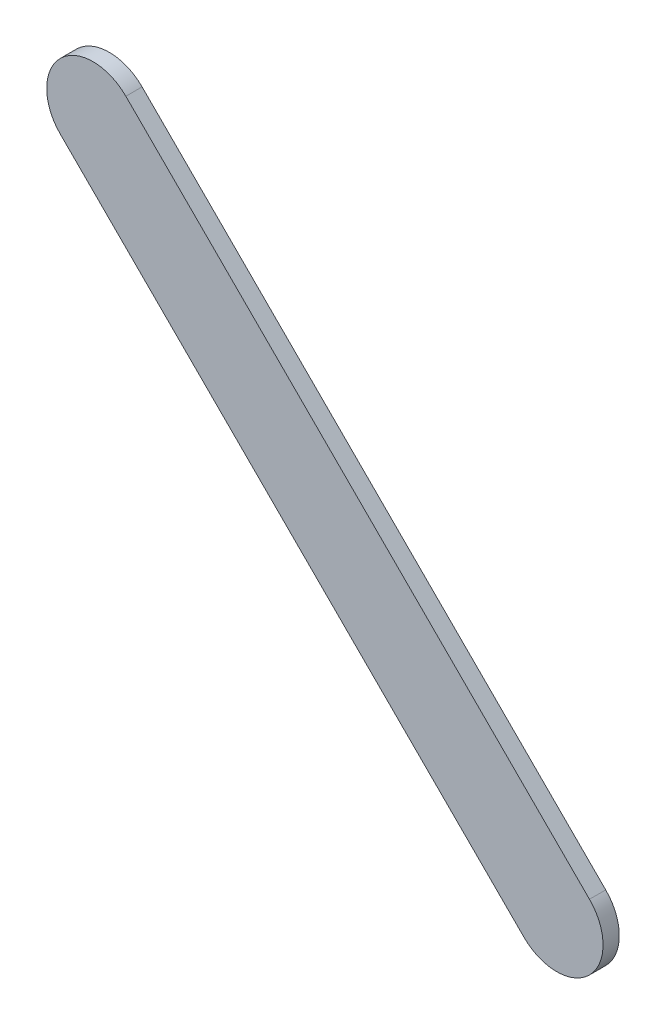
ISO-10303-21;
HEADER;
FILE_DESCRIPTION(('STEP AP214'),'2;1');
FILE_NAME('part.step','',(''),(''),'','','');
FILE_SCHEMA(('AUTOMOTIVE_DESIGN { 1 0 10303 214 1 1 1 1 }'));
ENDSEC;
DATA;
#1=APPLICATION_CONTEXT('core data for automotive mechanical design processes');
#2=APPLICATION_PROTOCOL_DEFINITION('international standard','automotive_design',2000,#1);
#3=PRODUCT_CONTEXT('',#1,'mechanical');
#4=PRODUCT('Part','Part','',(#3));
#5=PRODUCT_RELATED_PRODUCT_CATEGORY('part','',(#4));
#6=PRODUCT_DEFINITION_FORMATION('','',#4);
#7=PRODUCT_DEFINITION_CONTEXT('part definition',#1,'design');
#8=PRODUCT_DEFINITION('design','',#6,#7);
#9=PRODUCT_DEFINITION_SHAPE('','',#8);
#10=(LENGTH_UNIT() NAMED_UNIT(*) SI_UNIT(.MILLI.,.METRE.));
#11=(NAMED_UNIT(*) PLANE_ANGLE_UNIT() SI_UNIT($,.RADIAN.));
#12=(NAMED_UNIT(*) SI_UNIT($,.STERADIAN.) SOLID_ANGLE_UNIT());
#13=UNCERTAINTY_MEASURE_WITH_UNIT(LENGTH_MEASURE(1.E-05),#10,'distance_accuracy_value','');
#14=(GEOMETRIC_REPRESENTATION_CONTEXT(3) GLOBAL_UNCERTAINTY_ASSIGNED_CONTEXT((#13)) GLOBAL_UNIT_ASSIGNED_CONTEXT((#10,
#11,#12)) REPRESENTATION_CONTEXT('',''));
#15=CARTESIAN_POINT('',(0.,0.,0.));
#16=DIRECTION('',(0.,0.,1.));
#17=DIRECTION('',(1.,0.,0.));
#18=AXIS2_PLACEMENT_3D('',#15,#16,#17);
#19=CARTESIAN_POINT('',(86.07071,-136.744289,1.635));
#20=DIRECTION('',(0.,0.,1.));
#21=DIRECTION('',(1.,0.,0.));
#22=AXIS2_PLACEMENT_3D('',#19,#20,#21);
#23=PLANE('',#22);
#24=DIRECTION('',(-0.707106781186548,0.707106781186548,0.));
#25=VECTOR('',#24,1.);
#26=CARTESIAN_POINT('',(86.07071,-136.744289,1.635));
#27=LINE('',#26,#25);
#28=CARTESIAN_POINT('',(86.07071,-136.744289,1.635));
#29=VERTEX_POINT('',#28);
#30=CARTESIAN_POINT('',(85.07071,-135.744289,1.635));
#31=VERTEX_POINT('',#30);
#32=EDGE_CURVE('E82',#29,#31,#27,.T.);
#33=ORIENTED_EDGE('',*,*,#32,.T.);
#34=CARTESIAN_POINT('',(84.9999995,-135.8149995,1.635));
#35=DIRECTION('',(0.,0.,1.));
#36=DIRECTION('',(0.707106781187048,0.707106781186048,0.));
#37=AXIS2_PLACEMENT_3D('',#34,#35,#36);
#38=CIRCLE('',#37,0.09999974810218);
#39=CARTESIAN_POINT('',(84.929289,-135.88571,1.635));
#40=VERTEX_POINT('',#39);
#41=EDGE_CURVE('E104',#31,#40,#38,.T.);
#42=ORIENTED_EDGE('',*,*,#41,.T.);
#43=DIRECTION('',(0.707106781186548,-0.707106781186548,0.));
#44=VECTOR('',#43,1.);
#45=CARTESIAN_POINT('',(84.929289,-135.88571,1.635));
#46=LINE('',#45,#44);
#47=CARTESIAN_POINT('',(85.929289,-136.88571,1.635));
#48=VERTEX_POINT('',#47);
#49=EDGE_CURVE('E75',#40,#48,#46,.T.);
#50=ORIENTED_EDGE('',*,*,#49,.T.);
#51=CARTESIAN_POINT('',(85.9999995,-136.8149995,1.635));
#52=DIRECTION('',(0.,0.,1.));
#53=DIRECTION('',(-0.707106781187048,-0.707106781186048,0.));
#54=AXIS2_PLACEMENT_3D('',#51,#52,#53);
#55=CIRCLE('',#54,0.09999974810218);
#56=EDGE_CURVE('E11',#48,#29,#55,.T.);
#57=ORIENTED_EDGE('',*,*,#56,.T.);
#58=EDGE_LOOP('',(#33,#42,#50,#57));
#59=FACE_BOUND('',#58,.T.);
#60=ADVANCED_FACE('F17',(#59),#23,.T.);
#61=CARTESIAN_POINT('',(86.07071,-136.744289,1.6));
#62=DIRECTION('',(0.,0.,1.));
#63=DIRECTION('',(1.,0.,0.));
#64=AXIS2_PLACEMENT_3D('',#61,#62,#63);
#65=PLANE('',#64);
#66=CARTESIAN_POINT('',(85.9999995,-136.8149995,1.6));
#67=DIRECTION('',(0.,0.,1.));
#68=DIRECTION('',(-0.707106781187048,-0.707106781186048,0.));
#69=AXIS2_PLACEMENT_3D('',#66,#67,#68);
#70=CIRCLE('',#69,0.09999974810218);
#71=CARTESIAN_POINT('',(85.929289,-136.88571,1.6));
#72=VERTEX_POINT('',#71);
#73=CARTESIAN_POINT('',(86.07071,-136.744289,1.6));
#74=VERTEX_POINT('',#73);
#75=EDGE_CURVE('E26',#72,#74,#70,.T.);
#76=ORIENTED_EDGE('',*,*,#75,.F.);
#77=DIRECTION('',(0.707106781186548,-0.707106781186548,0.));
#78=VECTOR('',#77,1.);
#79=CARTESIAN_POINT('',(84.929289,-135.88571,1.6));
#80=LINE('',#79,#78);
#81=CARTESIAN_POINT('',(84.929289,-135.88571,1.6));
#82=VERTEX_POINT('',#81);
#83=EDGE_CURVE('E101',#82,#72,#80,.T.);
#84=ORIENTED_EDGE('',*,*,#83,.F.);
#85=CARTESIAN_POINT('',(84.9999995,-135.8149995,1.6));
#86=DIRECTION('',(0.,0.,1.));
#87=DIRECTION('',(0.707106781187048,0.707106781186048,0.));
#88=AXIS2_PLACEMENT_3D('',#85,#86,#87);
#89=CIRCLE('',#88,0.09999974810218);
#90=CARTESIAN_POINT('',(85.07071,-135.744289,1.6));
#91=VERTEX_POINT('',#90);
#92=EDGE_CURVE('E84',#91,#82,#89,.T.);
#93=ORIENTED_EDGE('',*,*,#92,.F.);
#94=DIRECTION('',(-0.707106781186548,0.707106781186548,0.));
#95=VECTOR('',#94,1.);
#96=CARTESIAN_POINT('',(86.07071,-136.744289,1.6));
#97=LINE('',#96,#95);
#98=EDGE_CURVE('E80',#74,#91,#97,.T.);
#99=ORIENTED_EDGE('',*,*,#98,.F.);
#100=EDGE_LOOP('',(#76,#84,#93,#99));
#101=FACE_BOUND('',#100,.T.);
#102=ADVANCED_FACE('F19',(#101),#65,.F.);
#103=CARTESIAN_POINT('',(85.9999995,-136.8149995,1.6));
#104=DIRECTION('',(0.,0.,-1.));
#105=DIRECTION('',(-0.707106781187048,-0.707106781186048,0.));
#106=AXIS2_PLACEMENT_3D('',#103,#104,#105);
#107=CYLINDRICAL_SURFACE('',#106,0.09999974810218);
#108=ORIENTED_EDGE('',*,*,#75,.T.);
#109=DIRECTION('',(0.,0.,1.));
#110=VECTOR('',#109,1.);
#111=CARTESIAN_POINT('',(86.07071,-136.744289,1.6));
#112=LINE('',#111,#110);
#113=EDGE_CURVE('E69',#74,#29,#112,.T.);
#114=ORIENTED_EDGE('',*,*,#113,.T.);
#115=ORIENTED_EDGE('',*,*,#56,.F.);
#116=DIRECTION('',(0.,0.,1.));
#117=VECTOR('',#116,1.);
#118=CARTESIAN_POINT('',(85.929289,-136.88571,1.6));
#119=LINE('',#118,#117);
#120=EDGE_CURVE('E72',#72,#48,#119,.T.);
#121=ORIENTED_EDGE('',*,*,#120,.F.);
#122=EDGE_LOOP('',(#108,#114,#115,#121));
#123=FACE_BOUND('',#122,.T.);
#124=ADVANCED_FACE('F68',(#123),#107,.T.);
#125=CARTESIAN_POINT('',(84.929289,-135.88571,1.6));
#126=DIRECTION('',(0.707106781186548,0.707106781186548,0.));
#127=DIRECTION('',(0.,0.,-1.));
#128=AXIS2_PLACEMENT_3D('',#125,#126,#127);
#129=PLANE('',#128);
#130=ORIENTED_EDGE('',*,*,#83,.T.);
#131=ORIENTED_EDGE('',*,*,#120,.T.);
#132=ORIENTED_EDGE('',*,*,#49,.F.);
#133=DIRECTION('',(0.,0.,1.));
#134=VECTOR('',#133,1.);
#135=CARTESIAN_POINT('',(84.929289,-135.88571,1.6));
#136=LINE('',#135,#134);
#137=EDGE_CURVE('E107',#82,#40,#136,.T.);
#138=ORIENTED_EDGE('',*,*,#137,.F.);
#139=EDGE_LOOP('',(#130,#131,#132,#138));
#140=FACE_BOUND('',#139,.T.);
#141=ADVANCED_FACE('F118',(#140),#129,.F.);
#142=CARTESIAN_POINT('',(84.9999995,-135.8149995,1.6));
#143=DIRECTION('',(0.,0.,-1.));
#144=DIRECTION('',(0.707106781187048,0.707106781186048,0.));
#145=AXIS2_PLACEMENT_3D('',#142,#143,#144);
#146=CYLINDRICAL_SURFACE('',#145,0.09999974810218);
#147=ORIENTED_EDGE('',*,*,#92,.T.);
#148=ORIENTED_EDGE('',*,*,#137,.T.);
#149=ORIENTED_EDGE('',*,*,#41,.F.);
#150=DIRECTION('',(0.,0.,1.));
#151=VECTOR('',#150,1.);
#152=CARTESIAN_POINT('',(85.07071,-135.744289,1.6));
#153=LINE('',#152,#151);
#154=EDGE_CURVE('E89',#91,#31,#153,.T.);
#155=ORIENTED_EDGE('',*,*,#154,.F.);
#156=EDGE_LOOP('',(#147,#148,#149,#155));
#157=FACE_BOUND('',#156,.T.);
#158=ADVANCED_FACE('F121',(#157),#146,.T.);
#159=CARTESIAN_POINT('',(86.07071,-136.744289,1.6));
#160=DIRECTION('',(-0.707106781186548,-0.707106781186548,0.));
#161=DIRECTION('',(-0.707106781186548,0.707106781186548,0.));
#162=AXIS2_PLACEMENT_3D('',#159,#160,#161);
#163=PLANE('',#162);
#164=ORIENTED_EDGE('',*,*,#98,.T.);
#165=ORIENTED_EDGE('',*,*,#154,.T.);
#166=ORIENTED_EDGE('',*,*,#32,.F.);
#167=ORIENTED_EDGE('',*,*,#113,.F.);
#168=EDGE_LOOP('',(#164,#165,#166,#167));
#169=FACE_BOUND('',#168,.T.);
#170=ADVANCED_FACE('F78',(#169),#163,.F.);
#171=CLOSED_SHELL('',(#60,#102,#124,#141,#158,#170));
#172=MANIFOLD_SOLID_BREP('B1',#171);
#173=ADVANCED_BREP_SHAPE_REPRESENTATION('',(#18,#172),#14);
#174=SHAPE_DEFINITION_REPRESENTATION(#9,#173);
ENDSEC;
END-ISO-10303-21;
